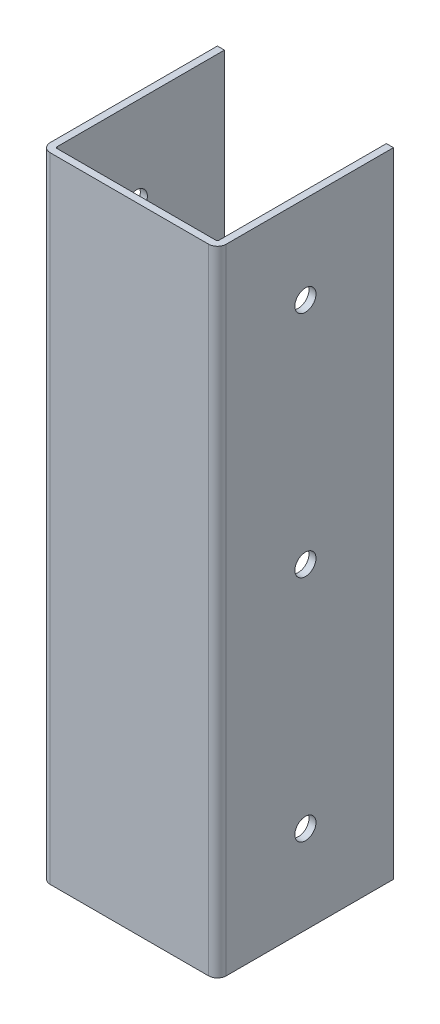
ISO-10303-21;
HEADER;
FILE_DESCRIPTION(('STEP AP214'),'2;1');
FILE_NAME('part.step','',(''),(''),'','','');
FILE_SCHEMA(('AUTOMOTIVE_DESIGN { 1 0 10303 214 1 1 1 1 }'));
ENDSEC;
DATA;
#1=APPLICATION_CONTEXT('core data for automotive mechanical design processes');
#2=APPLICATION_PROTOCOL_DEFINITION('international standard','automotive_design',2000,#1);
#3=PRODUCT_CONTEXT('',#1,'mechanical');
#4=PRODUCT('Part','Part','',(#3));
#5=PRODUCT_RELATED_PRODUCT_CATEGORY('part','',(#4));
#6=PRODUCT_DEFINITION_FORMATION('','',#4);
#7=PRODUCT_DEFINITION_CONTEXT('part definition',#1,'design');
#8=PRODUCT_DEFINITION('design','',#6,#7);
#9=PRODUCT_DEFINITION_SHAPE('','',#8);
#10=(LENGTH_UNIT() NAMED_UNIT(*) SI_UNIT(.MILLI.,.METRE.));
#11=(NAMED_UNIT(*) PLANE_ANGLE_UNIT() SI_UNIT($,.RADIAN.));
#12=(NAMED_UNIT(*) SI_UNIT($,.STERADIAN.) SOLID_ANGLE_UNIT());
#13=UNCERTAINTY_MEASURE_WITH_UNIT(LENGTH_MEASURE(1.E-05),#10,'distance_accuracy_value','');
#14=(GEOMETRIC_REPRESENTATION_CONTEXT(3) GLOBAL_UNCERTAINTY_ASSIGNED_CONTEXT((#13)) GLOBAL_UNIT_ASSIGNED_CONTEXT((#10,
#11,#12)) REPRESENTATION_CONTEXT('',''));
#15=CARTESIAN_POINT('',(0.,0.,0.));
#16=DIRECTION('',(0.,0.,1.));
#17=DIRECTION('',(1.,0.,0.));
#18=AXIS2_PLACEMENT_3D('',#15,#16,#17);
#19=CARTESIAN_POINT('',(-9375.78040350806,-4258.40551359307,-291.99));
#20=DIRECTION('',(-1.,0.,0.));
#21=DIRECTION('',(0.,0.,1.));
#22=AXIS2_PLACEMENT_3D('',#19,#20,#21);
#23=PLANE('',#22);
#24=DIRECTION('',(0.,-1.,0.));
#25=VECTOR('',#24,1.);
#26=CARTESIAN_POINT('',(-9375.78040350806,-4078.39551359307,-292.5));
#27=LINE('',#26,#25);
#28=CARTESIAN_POINT('',(-9375.78040350806,-4078.39551359307,-292.5));
#29=VERTEX_POINT('',#28);
#30=CARTESIAN_POINT('',(-9375.78040350806,-4258.39551359307,-292.5));
#31=VERTEX_POINT('',#30);
#32=EDGE_CURVE('E33',#29,#31,#27,.T.);
#33=ORIENTED_EDGE('',*,*,#32,.F.);
#34=DIRECTION('',(0.,0.,-1.));
#35=VECTOR('',#34,1.);
#36=CARTESIAN_POINT('',(-9375.78040350806,-4078.39551359307,-292.5));
#37=LINE('',#36,#35);
#38=CARTESIAN_POINT('',(-9375.78040350806,-4078.39551359307,-340.));
#39=VERTEX_POINT('',#38);
#40=EDGE_CURVE('E9',#29,#39,#37,.T.);
#41=ORIENTED_EDGE('',*,*,#40,.T.);
#42=DIRECTION('',(0.,-1.,0.));
#43=VECTOR('',#42,1.);
#44=CARTESIAN_POINT('',(-9375.78040350806,-4258.39551359307,-340.));
#45=LINE('',#44,#43);
#46=CARTESIAN_POINT('',(-9375.78040350806,-4258.39551359307,-340.));
#47=VERTEX_POINT('',#46);
#48=EDGE_CURVE('E25',#39,#47,#45,.T.);
#49=ORIENTED_EDGE('',*,*,#48,.T.);
#50=DIRECTION('',(0.,0.,1.));
#51=VECTOR('',#50,1.);
#52=CARTESIAN_POINT('',(-9375.78040350806,-4258.39551359307,-292.5));
#53=LINE('',#52,#51);
#54=EDGE_CURVE('E224',#47,#31,#53,.T.);
#55=ORIENTED_EDGE('',*,*,#54,.T.);
#56=EDGE_LOOP('',(#33,#41,#49,#55));
#57=FACE_BOUND('',#56,.T.);
#58=CARTESIAN_POINT('',(-9375.78040350806,-4103.39551359307,-315.));
#59=DIRECTION('',(1.,0.,0.));
#60=DIRECTION('',(0.,0.,1.));
#61=AXIS2_PLACEMENT_3D('',#58,#59,#60);
#62=CIRCLE('',#61,2.99999999999929);
#63=CARTESIAN_POINT('',(-9375.78040350806,-4103.39551359307,-312.000000000001));
#64=VERTEX_POINT('',#63);
#65=EDGE_CURVE('E226',#64,#64,#62,.T.);
#66=ORIENTED_EDGE('',*,*,#65,.T.);
#67=EDGE_LOOP('',(#66));
#68=FACE_BOUND('',#67,.T.);
#69=CARTESIAN_POINT('',(-9375.78040350806,-4233.39551359307,-314.999999995186));
#70=DIRECTION('',(1.,0.,0.));
#71=DIRECTION('',(0.,0.,1.));
#72=AXIS2_PLACEMENT_3D('',#69,#70,#71);
#73=CIRCLE('',#72,3.00000000000009);
#74=CARTESIAN_POINT('',(-9375.78040350806,-4233.39551359307,-311.999999995186));
#75=VERTEX_POINT('',#74);
#76=EDGE_CURVE('E258',#75,#75,#73,.T.);
#77=ORIENTED_EDGE('',*,*,#76,.T.);
#78=EDGE_LOOP('',(#77));
#79=FACE_BOUND('',#78,.T.);
#80=CARTESIAN_POINT('',(-9375.78040350806,-4168.39551359307,-315.));
#81=DIRECTION('',(1.,0.,0.));
#82=DIRECTION('',(0.,0.,1.));
#83=AXIS2_PLACEMENT_3D('',#80,#81,#82);
#84=CIRCLE('',#83,2.9999999999994);
#85=CARTESIAN_POINT('',(-9375.78040350806,-4168.39551359307,-312.000000000001));
#86=VERTEX_POINT('',#85);
#87=EDGE_CURVE('E255',#86,#86,#84,.T.);
#88=ORIENTED_EDGE('',*,*,#87,.T.);
#89=EDGE_LOOP('',(#88));
#90=FACE_BOUND('',#89,.T.);
#91=ADVANCED_FACE('F15',(#57,#68,#79,#90),#23,.T.);
#92=CARTESIAN_POINT('',(-9422.78040350807,-4103.39551359307,-314.999999999994));
#93=DIRECTION('',(1.,0.,0.));
#94=DIRECTION('',(0.,1.,0.));
#95=AXIS2_PLACEMENT_3D('',#92,#93,#94);
#96=CYLINDRICAL_SURFACE('',#95,3.100000000004);
#97=CARTESIAN_POINT('',(-9423.78040350807,-4103.39551359307,-314.999999999999));
#98=DIRECTION('',(1.,0.,0.));
#99=DIRECTION('',(0.,1.,0.));
#100=AXIS2_PLACEMENT_3D('',#97,#98,#99);
#101=CIRCLE('',#100,3.10000000000002);
#102=CARTESIAN_POINT('',(-9423.78040350807,-4100.29551359307,-314.999999999999));
#103=VERTEX_POINT('',#102);
#104=EDGE_CURVE('E233',#103,#103,#101,.T.);
#105=ORIENTED_EDGE('',*,*,#104,.F.);
#106=EDGE_LOOP('',(#105));
#107=FACE_BOUND('',#106,.T.);
#108=CARTESIAN_POINT('',(-9421.78040350807,-4103.39551359307,-314.999999999999));
#109=DIRECTION('',(-1.,0.,3.66731734585813E-13));
#110=DIRECTION('',(0.,1.,0.));
#111=AXIS2_PLACEMENT_3D('',#108,#109,#110);
#112=CIRCLE('',#111,3.10000000000002);
#113=CARTESIAN_POINT('',(-9421.78040350807,-4100.29551359307,-314.999999999999));
#114=VERTEX_POINT('',#113);
#115=EDGE_CURVE('E163',#114,#114,#112,.T.);
#116=ORIENTED_EDGE('',*,*,#115,.F.);
#117=EDGE_LOOP('',(#116));
#118=FACE_BOUND('',#117,.T.);
#119=ADVANCED_FACE('F279',(#107,#118),#96,.F.);
#120=CARTESIAN_POINT('',(-9422.78040350807,-4168.39551359307,-314.999999999996));
#121=DIRECTION('',(1.,0.,0.));
#122=DIRECTION('',(0.,1.,0.));
#123=AXIS2_PLACEMENT_3D('',#120,#121,#122);
#124=CYLINDRICAL_SURFACE('',#123,3.10000000000414);
#125=CARTESIAN_POINT('',(-9423.78040350807,-4168.39551359307,-315.));
#126=DIRECTION('',(1.,0.,0.));
#127=DIRECTION('',(0.,1.,0.));
#128=AXIS2_PLACEMENT_3D('',#125,#126,#127);
#129=CIRCLE('',#128,3.10000000000002);
#130=CARTESIAN_POINT('',(-9423.78040350807,-4165.29551359307,-315.));
#131=VERTEX_POINT('',#130);
#132=EDGE_CURVE('E244',#131,#131,#129,.T.);
#133=ORIENTED_EDGE('',*,*,#132,.F.);
#134=EDGE_LOOP('',(#133));
#135=FACE_BOUND('',#134,.T.);
#136=CARTESIAN_POINT('',(-9421.78040350807,-4168.39551359307,-315.));
#137=DIRECTION('',(-1.,0.,0.));
#138=DIRECTION('',(0.,0.,1.));
#139=AXIS2_PLACEMENT_3D('',#136,#137,#138);
#140=CIRCLE('',#139,3.10000000000002);
#141=CARTESIAN_POINT('',(-9421.78040350807,-4168.39551359307,-311.9));
#142=VERTEX_POINT('',#141);
#143=EDGE_CURVE('E252',#142,#142,#140,.T.);
#144=ORIENTED_EDGE('',*,*,#143,.F.);
#145=EDGE_LOOP('',(#144));
#146=FACE_BOUND('',#145,.T.);
#147=ADVANCED_FACE('F276',(#135,#146),#124,.F.);
#148=CARTESIAN_POINT('',(-9422.78040350807,-4233.39551359307,-314.99999999518));
#149=DIRECTION('',(1.,0.,0.));
#150=DIRECTION('',(0.,1.,0.));
#151=AXIS2_PLACEMENT_3D('',#148,#149,#150);
#152=CYLINDRICAL_SURFACE('',#151,3.09999999999604);
#153=CARTESIAN_POINT('',(-9423.78040350807,-4233.39551359307,-314.999999995186));
#154=DIRECTION('',(1.,0.,0.));
#155=DIRECTION('',(0.,1.,0.));
#156=AXIS2_PLACEMENT_3D('',#153,#154,#155);
#157=CIRCLE('',#156,3.10000000000002);
#158=CARTESIAN_POINT('',(-9423.78040350807,-4230.29551359307,-314.999999995186));
#159=VERTEX_POINT('',#158);
#160=EDGE_CURVE('E240',#159,#159,#157,.T.);
#161=ORIENTED_EDGE('',*,*,#160,.F.);
#162=EDGE_LOOP('',(#161));
#163=FACE_BOUND('',#162,.T.);
#164=CARTESIAN_POINT('',(-9421.78040350807,-4233.39551359307,-314.999999995186));
#165=DIRECTION('',(-1.,0.,0.));
#166=DIRECTION('',(0.,0.,1.));
#167=AXIS2_PLACEMENT_3D('',#164,#165,#166);
#168=CIRCLE('',#167,3.10000000000002);
#169=CARTESIAN_POINT('',(-9421.78040350807,-4233.39551359307,-311.899999995186));
#170=VERTEX_POINT('',#169);
#171=EDGE_CURVE('E158',#170,#170,#168,.T.);
#172=ORIENTED_EDGE('',*,*,#171,.F.);
#173=EDGE_LOOP('',(#172));
#174=FACE_BOUND('',#173,.T.);
#175=ADVANCED_FACE('F278',(#163,#174),#152,.F.);
#176=CARTESIAN_POINT('',(-9049.45661968544,-4078.38551359307,-340.));
#177=DIRECTION('',(0.,0.,1.));
#178=DIRECTION('',(1.,0.,0.));
#179=AXIS2_PLACEMENT_3D('',#176,#177,#178);
#180=PLANE('',#179);
#181=DIRECTION('',(0.,1.,0.));
#182=VECTOR('',#181,1.);
#183=CARTESIAN_POINT('',(-9423.78040350807,-4258.39551359307,-340.));
#184=LINE('',#183,#182);
#185=CARTESIAN_POINT('',(-9423.78040350807,-4258.39551359307,-340.));
#186=VERTEX_POINT('',#185);
#187=CARTESIAN_POINT('',(-9423.78040350807,-4078.39551359307,-340.));
#188=VERTEX_POINT('',#187);
#189=EDGE_CURVE('E239',#186,#188,#184,.T.);
#190=ORIENTED_EDGE('',*,*,#189,.T.);
#191=DIRECTION('',(-1.,0.,0.));
#192=VECTOR('',#191,1.);
#193=CARTESIAN_POINT('',(-9421.78040350807,-4078.39551359307,-340.));
#194=LINE('',#193,#192);
#195=CARTESIAN_POINT('',(-9421.78040350807,-4078.39551359307,-340.));
#196=VERTEX_POINT('',#195);
#197=EDGE_CURVE('E232',#196,#188,#194,.T.);
#198=ORIENTED_EDGE('',*,*,#197,.F.);
#199=DIRECTION('',(0.,1.,0.));
#200=VECTOR('',#199,1.);
#201=CARTESIAN_POINT('',(-9421.78040350807,-4078.39551359307,-340.));
#202=LINE('',#201,#200);
#203=CARTESIAN_POINT('',(-9421.78040350807,-4258.39551359307,-340.));
#204=VERTEX_POINT('',#203);
#205=EDGE_CURVE('E157',#204,#196,#202,.T.);
#206=ORIENTED_EDGE('',*,*,#205,.F.);
#207=DIRECTION('',(-1.,0.,0.));
#208=VECTOR('',#207,1.);
#209=CARTESIAN_POINT('',(-9421.78040350807,-4258.39551359307,-340.));
#210=LINE('',#209,#208);
#211=EDGE_CURVE('E154',#204,#186,#210,.T.);
#212=ORIENTED_EDGE('',*,*,#211,.T.);
#213=EDGE_LOOP('',(#190,#198,#206,#212));
#214=FACE_BOUND('',#213,.T.);
#215=ADVANCED_FACE('F287',(#214),#180,.F.);
#216=CARTESIAN_POINT('',(-9049.45661968544,-4258.39551359307,-291.99));
#217=DIRECTION('',(0.,1.,0.));
#218=DIRECTION('',(0.,0.,1.));
#219=AXIS2_PLACEMENT_3D('',#216,#217,#218);
#220=PLANE('',#219);
#221=DIRECTION('',(0.,0.,1.));
#222=VECTOR('',#221,1.);
#223=CARTESIAN_POINT('',(-9423.78040350807,-4258.39551359307,-292.5));
#224=LINE('',#223,#222);
#225=CARTESIAN_POINT('',(-9423.78040350807,-4258.39551359307,-292.5));
#226=VERTEX_POINT('',#225);
#227=EDGE_CURVE('E155',#186,#226,#224,.T.);
#228=ORIENTED_EDGE('',*,*,#227,.F.);
#229=ORIENTED_EDGE('',*,*,#211,.F.);
#230=DIRECTION('',(0.,0.,-1.));
#231=VECTOR('',#230,1.);
#232=CARTESIAN_POINT('',(-9421.78040350807,-4258.39551359307,-292.5));
#233=LINE('',#232,#231);
#234=CARTESIAN_POINT('',(-9421.78040350807,-4258.39551359307,-292.5));
#235=VERTEX_POINT('',#234);
#236=EDGE_CURVE('E149',#235,#204,#233,.T.);
#237=ORIENTED_EDGE('',*,*,#236,.F.);
#238=CARTESIAN_POINT('',(-9421.28040350807,-4258.39551359307,-292.5));
#239=DIRECTION('',(0.,1.,0.));
#240=DIRECTION('',(1.,0.,0.));
#241=AXIS2_PLACEMENT_3D('',#238,#239,#240);
#242=CIRCLE('',#241,0.499999999999691);
#243=CARTESIAN_POINT('',(-9421.28040350807,-4258.39551359307,-292.));
#244=VERTEX_POINT('',#243);
#245=EDGE_CURVE('E129',#235,#244,#242,.T.);
#246=ORIENTED_EDGE('',*,*,#245,.T.);
#247=DIRECTION('',(-1.,0.,0.));
#248=VECTOR('',#247,1.);
#249=CARTESIAN_POINT('',(-9421.28040350807,-4258.39551359307,-292.));
#250=LINE('',#249,#248);
#251=CARTESIAN_POINT('',(-9376.28040350807,-4258.39551359307,-292.));
#252=VERTEX_POINT('',#251);
#253=EDGE_CURVE('E121',#252,#244,#250,.T.);
#254=ORIENTED_EDGE('',*,*,#253,.F.);
#255=CARTESIAN_POINT('',(-9376.28040350807,-4258.39551359307,-292.5));
#256=DIRECTION('',(0.,1.,0.));
#257=DIRECTION('',(0.,0.,-1.));
#258=AXIS2_PLACEMENT_3D('',#255,#256,#257);
#259=CIRCLE('',#258,0.499999999999713);
#260=EDGE_CURVE('E196',#252,#31,#259,.T.);
#261=ORIENTED_EDGE('',*,*,#260,.T.);
#262=ORIENTED_EDGE('',*,*,#54,.F.);
#263=DIRECTION('',(1.,0.,0.));
#264=VECTOR('',#263,1.);
#265=CARTESIAN_POINT('',(-9375.78040350806,-4258.39551359307,-340.));
#266=LINE('',#265,#264);
#267=CARTESIAN_POINT('',(-9373.78040350806,-4258.39551359307,-340.));
#268=VERTEX_POINT('',#267);
#269=EDGE_CURVE('E165',#47,#268,#266,.T.);
#270=ORIENTED_EDGE('',*,*,#269,.T.);
#271=DIRECTION('',(0.,0.,1.));
#272=VECTOR('',#271,1.);
#273=CARTESIAN_POINT('',(-9373.78040350806,-4258.39551359307,-292.5));
#274=LINE('',#273,#272);
#275=CARTESIAN_POINT('',(-9373.78040350806,-4258.39551359307,-292.5));
#276=VERTEX_POINT('',#275);
#277=EDGE_CURVE('E167',#268,#276,#274,.T.);
#278=ORIENTED_EDGE('',*,*,#277,.T.);
#279=CARTESIAN_POINT('',(-9376.28040350807,-4258.39551359307,-292.5));
#280=DIRECTION('',(0.,1.,0.));
#281=DIRECTION('',(0.,0.,-1.));
#282=AXIS2_PLACEMENT_3D('',#279,#280,#281);
#283=CIRCLE('',#282,2.49999999999972);
#284=CARTESIAN_POINT('',(-9376.28040350807,-4258.39551359307,-290.));
#285=VERTEX_POINT('',#284);
#286=EDGE_CURVE('E174',#285,#276,#283,.T.);
#287=ORIENTED_EDGE('',*,*,#286,.F.);
#288=DIRECTION('',(-1.,0.,0.));
#289=VECTOR('',#288,1.);
#290=CARTESIAN_POINT('',(-9376.28040350807,-4258.39551359307,-290.));
#291=LINE('',#290,#289);
#292=CARTESIAN_POINT('',(-9421.28040350807,-4258.39551359307,-290.));
#293=VERTEX_POINT('',#292);
#294=EDGE_CURVE('E168',#285,#293,#291,.T.);
#295=ORIENTED_EDGE('',*,*,#294,.T.);
#296=CARTESIAN_POINT('',(-9421.28040350807,-4258.39551359307,-292.5));
#297=DIRECTION('',(0.,1.,0.));
#298=DIRECTION('',(1.,0.,0.));
#299=AXIS2_PLACEMENT_3D('',#296,#297,#298);
#300=CIRCLE('',#299,2.4999999999997);
#301=EDGE_CURVE('E19',#226,#293,#300,.T.);
#302=ORIENTED_EDGE('',*,*,#301,.F.);
#303=EDGE_LOOP('',(#228,#229,#237,#246,#254,#261,#262,#270,#278,#287,#295,#302));
#304=FACE_BOUND('',#303,.T.);
#305=ADVANCED_FACE('F214',(#304),#220,.F.);
#306=CARTESIAN_POINT('',(-9423.78040350807,-4258.40551359307,-289.99));
#307=DIRECTION('',(-1.,0.,0.));
#308=DIRECTION('',(0.,0.,1.));
#309=AXIS2_PLACEMENT_3D('',#306,#307,#308);
#310=PLANE('',#309);
#311=DIRECTION('',(0.,-1.,0.));
#312=VECTOR('',#311,1.);
#313=CARTESIAN_POINT('',(-9423.78040350807,-4078.39551359307,-292.5));
#314=LINE('',#313,#312);
#315=CARTESIAN_POINT('',(-9423.78040350807,-4078.39551359307,-292.5));
#316=VERTEX_POINT('',#315);
#317=EDGE_CURVE('E139',#316,#226,#314,.T.);
#318=ORIENTED_EDGE('',*,*,#317,.F.);
#319=DIRECTION('',(0.,0.,-1.));
#320=VECTOR('',#319,1.);
#321=CARTESIAN_POINT('',(-9423.78040350807,-4078.39551359307,-292.5));
#322=LINE('',#321,#320);
#323=EDGE_CURVE('E151',#316,#188,#322,.T.);
#324=ORIENTED_EDGE('',*,*,#323,.T.);
#325=ORIENTED_EDGE('',*,*,#189,.F.);
#326=ORIENTED_EDGE('',*,*,#227,.T.);
#327=EDGE_LOOP('',(#318,#324,#325,#326));
#328=FACE_BOUND('',#327,.T.);
#329=ORIENTED_EDGE('',*,*,#160,.T.);
#330=EDGE_LOOP('',(#329));
#331=FACE_BOUND('',#330,.T.);
#332=ORIENTED_EDGE('',*,*,#132,.T.);
#333=EDGE_LOOP('',(#332));
#334=FACE_BOUND('',#333,.T.);
#335=ORIENTED_EDGE('',*,*,#104,.T.);
#336=EDGE_LOOP('',(#335));
#337=FACE_BOUND('',#336,.T.);
#338=ADVANCED_FACE('F303',(#328,#331,#334,#337),#310,.T.);
#339=CARTESIAN_POINT('',(-9049.45661968544,-4078.39551359307,-291.99));
#340=DIRECTION('',(0.,-1.,0.));
#341=DIRECTION('',(0.,0.,-1.));
#342=AXIS2_PLACEMENT_3D('',#339,#340,#341);
#343=PLANE('',#342);
#344=ORIENTED_EDGE('',*,*,#323,.F.);
#345=CARTESIAN_POINT('',(-9421.28040350807,-4078.39551359307,-292.5));
#346=DIRECTION('',(0.,-1.,0.));
#347=DIRECTION('',(1.,0.,0.));
#348=AXIS2_PLACEMENT_3D('',#345,#346,#347);
#349=CIRCLE('',#348,2.4999999999997);
#350=CARTESIAN_POINT('',(-9421.28040350807,-4078.39551359307,-290.));
#351=VERTEX_POINT('',#350);
#352=EDGE_CURVE('E137',#351,#316,#349,.T.);
#353=ORIENTED_EDGE('',*,*,#352,.F.);
#354=DIRECTION('',(1.,0.,0.));
#355=VECTOR('',#354,1.);
#356=CARTESIAN_POINT('',(-9421.28040350807,-4078.39551359307,-290.));
#357=LINE('',#356,#355);
#358=CARTESIAN_POINT('',(-9376.28040350807,-4078.39551359307,-290.));
#359=VERTEX_POINT('',#358);
#360=EDGE_CURVE('E187',#351,#359,#357,.T.);
#361=ORIENTED_EDGE('',*,*,#360,.T.);
#362=CARTESIAN_POINT('',(-9376.28040350807,-4078.39551359307,-292.5));
#363=DIRECTION('',(0.,-1.,0.));
#364=DIRECTION('',(0.,0.,-1.));
#365=AXIS2_PLACEMENT_3D('',#362,#363,#364);
#366=CIRCLE('',#365,2.49999999999972);
#367=CARTESIAN_POINT('',(-9373.78040350807,-4078.39551359307,-292.5));
#368=VERTEX_POINT('',#367);
#369=EDGE_CURVE('E135',#368,#359,#366,.T.);
#370=ORIENTED_EDGE('',*,*,#369,.F.);
#371=DIRECTION('',(0.,0.,1.));
#372=VECTOR('',#371,1.);
#373=CARTESIAN_POINT('',(-9373.78040350806,-4078.39551359307,-292.5));
#374=LINE('',#373,#372);
#375=CARTESIAN_POINT('',(-9373.78040350806,-4078.39551359307,-340.));
#376=VERTEX_POINT('',#375);
#377=EDGE_CURVE('E170',#376,#368,#374,.T.);
#378=ORIENTED_EDGE('',*,*,#377,.F.);
#379=DIRECTION('',(1.,0.,0.));
#380=VECTOR('',#379,1.);
#381=CARTESIAN_POINT('',(-9375.78040350806,-4078.39551359307,-340.));
#382=LINE('',#381,#380);
#383=EDGE_CURVE('E164',#39,#376,#382,.T.);
#384=ORIENTED_EDGE('',*,*,#383,.F.);
#385=ORIENTED_EDGE('',*,*,#40,.F.);
#386=CARTESIAN_POINT('',(-9376.28040350807,-4078.39551359307,-292.5));
#387=DIRECTION('',(0.,-1.,0.));
#388=DIRECTION('',(0.,0.,-1.));
#389=AXIS2_PLACEMENT_3D('',#386,#387,#388);
#390=CIRCLE('',#389,0.499999999999713);
#391=CARTESIAN_POINT('',(-9376.28040350807,-4078.39551359307,-292.));
#392=VERTEX_POINT('',#391);
#393=EDGE_CURVE('E114',#29,#392,#390,.T.);
#394=ORIENTED_EDGE('',*,*,#393,.T.);
#395=DIRECTION('',(1.,0.,0.));
#396=VECTOR('',#395,1.);
#397=CARTESIAN_POINT('',(-9421.28040350807,-4078.39551359307,-292.));
#398=LINE('',#397,#396);
#399=CARTESIAN_POINT('',(-9421.28040350807,-4078.39551359307,-292.));
#400=VERTEX_POINT('',#399);
#401=EDGE_CURVE('E107',#400,#392,#398,.T.);
#402=ORIENTED_EDGE('',*,*,#401,.F.);
#403=CARTESIAN_POINT('',(-9421.28040350807,-4078.39551359307,-292.5));
#404=DIRECTION('',(0.,-1.,0.));
#405=DIRECTION('',(1.,0.,0.));
#406=AXIS2_PLACEMENT_3D('',#403,#404,#405);
#407=CIRCLE('',#406,0.499999999999691);
#408=CARTESIAN_POINT('',(-9421.78040350807,-4078.39551359307,-292.5));
#409=VERTEX_POINT('',#408);
#410=EDGE_CURVE('E113',#400,#409,#407,.T.);
#411=ORIENTED_EDGE('',*,*,#410,.T.);
#412=DIRECTION('',(0.,0.,1.));
#413=VECTOR('',#412,1.);
#414=CARTESIAN_POINT('',(-9421.78040350807,-4078.39551359307,-292.5));
#415=LINE('',#414,#413);
#416=EDGE_CURVE('E156',#196,#409,#415,.T.);
#417=ORIENTED_EDGE('',*,*,#416,.F.);
#418=ORIENTED_EDGE('',*,*,#197,.T.);
#419=EDGE_LOOP('',(#344,#353,#361,#370,#378,#384,#385,#394,#402,#411,#417,#418));
#420=FACE_BOUND('',#419,.T.);
#421=ADVANCED_FACE('F110',(#420),#343,.F.);
#422=CARTESIAN_POINT('',(-9421.78040350807,-4078.38551359307,-291.99));
#423=DIRECTION('',(1.,0.,0.));
#424=DIRECTION('',(0.,0.,-1.));
#425=AXIS2_PLACEMENT_3D('',#422,#423,#424);
#426=PLANE('',#425);
#427=DIRECTION('',(0.,1.,0.));
#428=VECTOR('',#427,1.);
#429=CARTESIAN_POINT('',(-9421.78040350807,-4258.39551359307,-292.5));
#430=LINE('',#429,#428);
#431=EDGE_CURVE('E127',#235,#409,#430,.T.);
#432=ORIENTED_EDGE('',*,*,#431,.F.);
#433=ORIENTED_EDGE('',*,*,#236,.T.);
#434=ORIENTED_EDGE('',*,*,#205,.T.);
#435=ORIENTED_EDGE('',*,*,#416,.T.);
#436=EDGE_LOOP('',(#432,#433,#434,#435));
#437=FACE_BOUND('',#436,.T.);
#438=ORIENTED_EDGE('',*,*,#171,.T.);
#439=EDGE_LOOP('',(#438));
#440=FACE_BOUND('',#439,.T.);
#441=ORIENTED_EDGE('',*,*,#143,.T.);
#442=EDGE_LOOP('',(#441));
#443=FACE_BOUND('',#442,.T.);
#444=ORIENTED_EDGE('',*,*,#115,.T.);
#445=EDGE_LOOP('',(#444));
#446=FACE_BOUND('',#445,.T.);
#447=ADVANCED_FACE('F274',(#437,#440,#443,#446),#426,.T.);
#448=CARTESIAN_POINT('',(-9748.1041873307,-4258.40551359307,-340.));
#449=DIRECTION('',(0.,0.,1.));
#450=DIRECTION('',(1.,0.,0.));
#451=AXIS2_PLACEMENT_3D('',#448,#449,#450);
#452=PLANE('',#451);
#453=DIRECTION('',(0.,-1.,0.));
#454=VECTOR('',#453,1.);
#455=CARTESIAN_POINT('',(-9373.78040350806,-4258.39551359307,-340.));
#456=LINE('',#455,#454);
#457=EDGE_CURVE('E160',#376,#268,#456,.T.);
#458=ORIENTED_EDGE('',*,*,#457,.T.);
#459=ORIENTED_EDGE('',*,*,#269,.F.);
#460=ORIENTED_EDGE('',*,*,#48,.F.);
#461=ORIENTED_EDGE('',*,*,#383,.T.);
#462=EDGE_LOOP('',(#458,#459,#460,#461));
#463=FACE_BOUND('',#462,.T.);
#464=ADVANCED_FACE('F222',(#463),#452,.F.);
#465=CARTESIAN_POINT('',(-9373.78040350806,-4078.38551359307,-289.99));
#466=DIRECTION('',(1.,0.,0.));
#467=DIRECTION('',(0.,0.,-1.));
#468=AXIS2_PLACEMENT_3D('',#465,#466,#467);
#469=PLANE('',#468);
#470=DIRECTION('',(0.,1.,0.));
#471=VECTOR('',#470,1.);
#472=CARTESIAN_POINT('',(-9373.78040350806,-4258.39551359307,-292.5));
#473=LINE('',#472,#471);
#474=EDGE_CURVE('E131',#276,#368,#473,.T.);
#475=ORIENTED_EDGE('',*,*,#474,.F.);
#476=ORIENTED_EDGE('',*,*,#277,.F.);
#477=ORIENTED_EDGE('',*,*,#457,.F.);
#478=ORIENTED_EDGE('',*,*,#377,.T.);
#479=EDGE_LOOP('',(#475,#476,#477,#478));
#480=FACE_BOUND('',#479,.T.);
#481=CARTESIAN_POINT('',(-9373.78040350806,-4233.39551359307,-314.999999995185));
#482=DIRECTION('',(1.,-9.14881018302215E-13,-9.14881018302248E-13));
#483=DIRECTION('',(9.14881018302215E-13,1.,0.));
#484=AXIS2_PLACEMENT_3D('',#481,#482,#483);
#485=CIRCLE('',#484,2.99999999999898);
#486=CARTESIAN_POINT('',(-9373.78040350806,-4230.39551359307,-314.999999995185));
#487=VERTEX_POINT('',#486);
#488=EDGE_CURVE('E177',#487,#487,#485,.T.);
#489=ORIENTED_EDGE('',*,*,#488,.F.);
#490=EDGE_LOOP('',(#489));
#491=FACE_BOUND('',#490,.T.);
#492=CARTESIAN_POINT('',(-9373.78040350806,-4103.39551359307,-315.));
#493=DIRECTION('',(1.,-9.14881018302607E-13,-9.14881018302639E-13));
#494=DIRECTION('',(9.14881018302607E-13,1.,0.));
#495=AXIS2_PLACEMENT_3D('',#492,#493,#494);
#496=CIRCLE('',#495,2.99999999999955);
#497=CARTESIAN_POINT('',(-9373.78040350806,-4100.39551359307,-315.));
#498=VERTEX_POINT('',#497);
#499=EDGE_CURVE('E145',#498,#498,#496,.T.);
#500=ORIENTED_EDGE('',*,*,#499,.F.);
#501=EDGE_LOOP('',(#500));
#502=FACE_BOUND('',#501,.T.);
#503=CARTESIAN_POINT('',(-9373.78040350806,-4168.39551359307,-315.));
#504=DIRECTION('',(1.,0.,0.));
#505=DIRECTION('',(0.,0.,1.));
#506=AXIS2_PLACEMENT_3D('',#503,#504,#505);
#507=CIRCLE('',#506,2.99999999999955);
#508=CARTESIAN_POINT('',(-9373.78040350806,-4168.39551359307,-312.000000000001));
#509=VERTEX_POINT('',#508);
#510=EDGE_CURVE('E180',#509,#509,#507,.T.);
#511=ORIENTED_EDGE('',*,*,#510,.F.);
#512=EDGE_LOOP('',(#511));
#513=FACE_BOUND('',#512,.T.);
#514=ADVANCED_FACE('F219',(#480,#491,#502,#513),#469,.T.);
#515=CARTESIAN_POINT('',(-9421.79040350807,-4258.40551359307,-292.));
#516=DIRECTION('',(0.,0.,-1.));
#517=DIRECTION('',(-1.,0.,0.));
#518=AXIS2_PLACEMENT_3D('',#515,#516,#517);
#519=PLANE('',#518);
#520=ORIENTED_EDGE('',*,*,#253,.T.);
#521=DIRECTION('',(0.,1.,0.));
#522=VECTOR('',#521,1.);
#523=CARTESIAN_POINT('',(-9421.28040350807,-4258.39551359307,-292.));
#524=LINE('',#523,#522);
#525=EDGE_CURVE('E116',#244,#400,#524,.T.);
#526=ORIENTED_EDGE('',*,*,#525,.T.);
#527=ORIENTED_EDGE('',*,*,#401,.T.);
#528=DIRECTION('',(0.,-1.,0.));
#529=VECTOR('',#528,1.);
#530=CARTESIAN_POINT('',(-9376.28040350807,-4078.39551359307,-292.));
#531=LINE('',#530,#529);
#532=EDGE_CURVE('E101',#392,#252,#531,.T.);
#533=ORIENTED_EDGE('',*,*,#532,.T.);
#534=EDGE_LOOP('',(#520,#526,#527,#533));
#535=FACE_BOUND('',#534,.T.);
#536=ADVANCED_FACE('F119',(#535),#519,.T.);
#537=CARTESIAN_POINT('',(-9423.79040350807,-4258.40551359307,-290.));
#538=DIRECTION('',(0.,0.,1.));
#539=DIRECTION('',(1.,0.,0.));
#540=AXIS2_PLACEMENT_3D('',#537,#538,#539);
#541=PLANE('',#540);
#542=ORIENTED_EDGE('',*,*,#360,.F.);
#543=DIRECTION('',(0.,-1.,0.));
#544=VECTOR('',#543,1.);
#545=CARTESIAN_POINT('',(-9421.28040350807,-4078.39551359307,-290.));
#546=LINE('',#545,#544);
#547=EDGE_CURVE('E192',#351,#293,#546,.T.);
#548=ORIENTED_EDGE('',*,*,#547,.T.);
#549=ORIENTED_EDGE('',*,*,#294,.F.);
#550=DIRECTION('',(0.,1.,0.));
#551=VECTOR('',#550,1.);
#552=CARTESIAN_POINT('',(-9376.28040350807,-4258.39551359307,-290.));
#553=LINE('',#552,#551);
#554=EDGE_CURVE('E194',#285,#359,#553,.T.);
#555=ORIENTED_EDGE('',*,*,#554,.T.);
#556=EDGE_LOOP('',(#542,#548,#549,#555));
#557=FACE_BOUND('',#556,.T.);
#558=ADVANCED_FACE('F209',(#557),#541,.T.);
#559=CARTESIAN_POINT('',(-9376.28040350807,-3846.8125250321,-292.5));
#560=DIRECTION('',(0.,-1.,0.));
#561=DIRECTION('',(0.,0.,-1.));
#562=AXIS2_PLACEMENT_3D('',#559,#560,#561);
#563=CYLINDRICAL_SURFACE('',#562,2.49999999999972);
#564=ORIENTED_EDGE('',*,*,#369,.T.);
#565=ORIENTED_EDGE('',*,*,#554,.F.);
#566=ORIENTED_EDGE('',*,*,#286,.T.);
#567=ORIENTED_EDGE('',*,*,#474,.T.);
#568=EDGE_LOOP('',(#564,#565,#566,#567));
#569=FACE_BOUND('',#568,.T.);
#570=ADVANCED_FACE('F203',(#569),#563,.T.);
#571=CARTESIAN_POINT('',(-9376.28040350807,-3846.8125250321,-292.5));
#572=DIRECTION('',(0.,-1.,0.));
#573=DIRECTION('',(0.,0.,-1.));
#574=AXIS2_PLACEMENT_3D('',#571,#572,#573);
#575=CYLINDRICAL_SURFACE('',#574,0.499999999999713);
#576=ORIENTED_EDGE('',*,*,#393,.F.);
#577=ORIENTED_EDGE('',*,*,#32,.T.);
#578=ORIENTED_EDGE('',*,*,#260,.F.);
#579=ORIENTED_EDGE('',*,*,#532,.F.);
#580=EDGE_LOOP('',(#576,#577,#578,#579));
#581=FACE_BOUND('',#580,.T.);
#582=ADVANCED_FACE('F17',(#581),#575,.F.);
#583=CARTESIAN_POINT('',(-9421.28040350807,-4476.39537284368,-292.5));
#584=DIRECTION('',(0.,1.,0.));
#585=DIRECTION('',(1.,0.,0.));
#586=AXIS2_PLACEMENT_3D('',#583,#584,#585);
#587=CYLINDRICAL_SURFACE('',#586,2.4999999999997);
#588=ORIENTED_EDGE('',*,*,#301,.T.);
#589=ORIENTED_EDGE('',*,*,#547,.F.);
#590=ORIENTED_EDGE('',*,*,#352,.T.);
#591=ORIENTED_EDGE('',*,*,#317,.T.);
#592=EDGE_LOOP('',(#588,#589,#590,#591));
#593=FACE_BOUND('',#592,.T.);
#594=ADVANCED_FACE('F323',(#593),#587,.T.);
#595=CARTESIAN_POINT('',(-9421.28040350807,-4476.39537284368,-292.5));
#596=DIRECTION('',(0.,1.,0.));
#597=DIRECTION('',(1.,0.,0.));
#598=AXIS2_PLACEMENT_3D('',#595,#596,#597);
#599=CYLINDRICAL_SURFACE('',#598,0.499999999999691);
#600=ORIENTED_EDGE('',*,*,#245,.F.);
#601=ORIENTED_EDGE('',*,*,#431,.T.);
#602=ORIENTED_EDGE('',*,*,#410,.F.);
#603=ORIENTED_EDGE('',*,*,#525,.F.);
#604=EDGE_LOOP('',(#600,#601,#602,#603));
#605=FACE_BOUND('',#604,.T.);
#606=ADVANCED_FACE('F126',(#605),#599,.F.);
#607=CARTESIAN_POINT('',(-9375.78040350806,-4103.39551359307,-315.));
#608=DIRECTION('',(-1.,0.,0.));
#609=DIRECTION('',(0.,0.,1.));
#610=AXIS2_PLACEMENT_3D('',#607,#608,#609);
#611=CYLINDRICAL_SURFACE('',#610,2.99999999999929);
#612=ORIENTED_EDGE('',*,*,#499,.T.);
#613=EDGE_LOOP('',(#612));
#614=FACE_BOUND('',#613,.T.);
#615=ORIENTED_EDGE('',*,*,#65,.F.);
#616=EDGE_LOOP('',(#615));
#617=FACE_BOUND('',#616,.T.);
#618=ADVANCED_FACE('F325',(#614,#617),#611,.F.);
#619=CARTESIAN_POINT('',(-9375.78040350806,-4168.39551359307,-315.));
#620=DIRECTION('',(-1.,0.,0.));
#621=DIRECTION('',(0.,0.,1.));
#622=AXIS2_PLACEMENT_3D('',#619,#620,#621);
#623=CYLINDRICAL_SURFACE('',#622,2.9999999999994);
#624=ORIENTED_EDGE('',*,*,#510,.T.);
#625=EDGE_LOOP('',(#624));
#626=FACE_BOUND('',#625,.T.);
#627=ORIENTED_EDGE('',*,*,#87,.F.);
#628=EDGE_LOOP('',(#627));
#629=FACE_BOUND('',#628,.T.);
#630=ADVANCED_FACE('F328',(#626,#629),#623,.F.);
#631=CARTESIAN_POINT('',(-9375.78040350806,-4233.39551359307,-314.999999995186));
#632=DIRECTION('',(-1.,0.,0.));
#633=DIRECTION('',(0.,0.,1.));
#634=AXIS2_PLACEMENT_3D('',#631,#632,#633);
#635=CYLINDRICAL_SURFACE('',#634,3.00000000000009);
#636=ORIENTED_EDGE('',*,*,#488,.T.);
#637=EDGE_LOOP('',(#636));
#638=FACE_BOUND('',#637,.T.);
#639=ORIENTED_EDGE('',*,*,#76,.F.);
#640=EDGE_LOOP('',(#639));
#641=FACE_BOUND('',#640,.T.);
#642=ADVANCED_FACE('F330',(#638,#641),#635,.F.);
#643=CLOSED_SHELL('',(#91,#119,#147,#175,#215,#305,#338,#421,#447,#464,#514,#536,#558,#570,#582,
#594,#606,#618,#630,#642));
#644=MANIFOLD_SOLID_BREP('B1',#643);
#645=ADVANCED_BREP_SHAPE_REPRESENTATION('',(#18,#644),#14);
#646=SHAPE_DEFINITION_REPRESENTATION(#9,#645);
ENDSEC;
END-ISO-10303-21;
